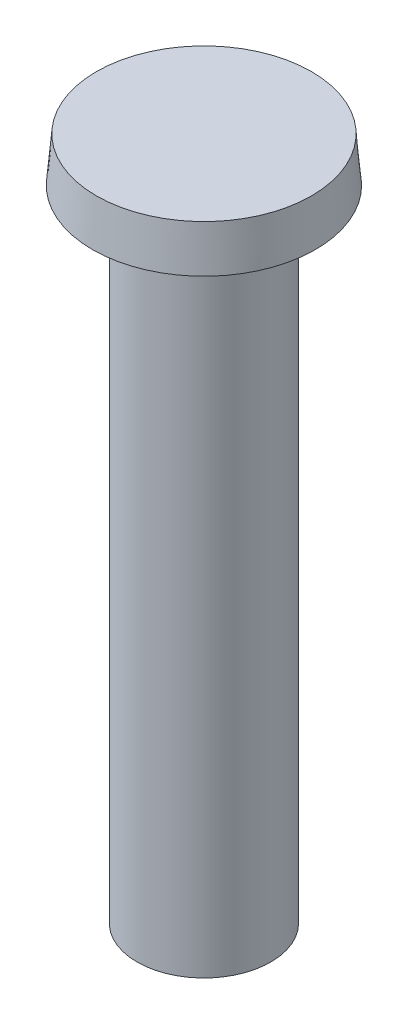
ISO-10303-21;
HEADER;
FILE_DESCRIPTION(('STEP AP214'),'2;1');
FILE_NAME('part.step','',(''),(''),'','','');
FILE_SCHEMA(('AUTOMOTIVE_DESIGN { 1 0 10303 214 1 1 1 1 }'));
ENDSEC;
DATA;
#1=APPLICATION_CONTEXT('core data for automotive mechanical design processes');
#2=APPLICATION_PROTOCOL_DEFINITION('international standard','automotive_design',2000,#1);
#3=PRODUCT_CONTEXT('',#1,'mechanical');
#4=PRODUCT('Part','Part','',(#3));
#5=PRODUCT_RELATED_PRODUCT_CATEGORY('part','',(#4));
#6=PRODUCT_DEFINITION_FORMATION('','',#4);
#7=PRODUCT_DEFINITION_CONTEXT('part definition',#1,'design');
#8=PRODUCT_DEFINITION('design','',#6,#7);
#9=PRODUCT_DEFINITION_SHAPE('','',#8);
#10=(LENGTH_UNIT() NAMED_UNIT(*) SI_UNIT(.MILLI.,.METRE.));
#11=(NAMED_UNIT(*) PLANE_ANGLE_UNIT() SI_UNIT($,.RADIAN.));
#12=(NAMED_UNIT(*) SI_UNIT($,.STERADIAN.) SOLID_ANGLE_UNIT());
#13=UNCERTAINTY_MEASURE_WITH_UNIT(LENGTH_MEASURE(1.E-05),#10,'distance_accuracy_value','');
#14=(GEOMETRIC_REPRESENTATION_CONTEXT(3) GLOBAL_UNCERTAINTY_ASSIGNED_CONTEXT((#13)) GLOBAL_UNIT_ASSIGNED_CONTEXT((#10,
#11,#12)) REPRESENTATION_CONTEXT('',''));
#15=CARTESIAN_POINT('',(0.,0.,0.));
#16=DIRECTION('',(0.,0.,1.));
#17=DIRECTION('',(1.,0.,0.));
#18=AXIS2_PLACEMENT_3D('',#15,#16,#17);
#19=CARTESIAN_POINT('',(0.,21.5,0.));
#20=DIRECTION('',(0.,-1.,0.));
#21=DIRECTION('',(0.,0.,-1.));
#22=AXIS2_PLACEMENT_3D('',#19,#20,#21);
#23=CYLINDRICAL_SURFACE('',#22,2.25);
#24=CARTESIAN_POINT('',(0.,21.5,0.));
#25=DIRECTION('',(0.,1.,0.));
#26=DIRECTION('',(0.,0.,1.));
#27=AXIS2_PLACEMENT_3D('',#24,#25,#26);
#28=CIRCLE('',#27,2.25);
#29=CARTESIAN_POINT('',(0.,21.5,2.25));
#30=VERTEX_POINT('',#29);
#31=EDGE_CURVE('E10',#30,#30,#28,.T.);
#32=ORIENTED_EDGE('',*,*,#31,.F.);
#33=EDGE_LOOP('',(#32));
#34=FACE_BOUND('',#33,.T.);
#35=CARTESIAN_POINT('',(0.,0.,0.));
#36=DIRECTION('',(0.,1.,0.));
#37=DIRECTION('',(0.,0.,1.));
#38=AXIS2_PLACEMENT_3D('',#35,#36,#37);
#39=CIRCLE('',#38,2.25);
#40=CARTESIAN_POINT('',(0.,0.,2.25));
#41=VERTEX_POINT('',#40);
#42=EDGE_CURVE('E38',#41,#41,#39,.T.);
#43=ORIENTED_EDGE('',*,*,#42,.T.);
#44=EDGE_LOOP('',(#43));
#45=FACE_BOUND('',#44,.T.);
#46=ADVANCED_FACE('F35',(#34,#45),#23,.T.);
#47=CARTESIAN_POINT('',(0.,0.,0.));
#48=DIRECTION('',(0.,1.,0.));
#49=DIRECTION('',(0.,0.,1.));
#50=AXIS2_PLACEMENT_3D('',#47,#48,#49);
#51=PLANE('',#50);
#52=CARTESIAN_POINT('',(0.,0.,0.));
#53=DIRECTION('',(0.,-1.,0.));
#54=DIRECTION('',(0.,0.,-1.));
#55=AXIS2_PLACEMENT_3D('',#52,#53,#54);
#56=CIRCLE('',#55,1.);
#57=CARTESIAN_POINT('',(0.,0.,-1.));
#58=VERTEX_POINT('',#57);
#59=EDGE_CURVE('E55',#58,#58,#56,.T.);
#60=ORIENTED_EDGE('',*,*,#59,.F.);
#61=EDGE_LOOP('',(#60));
#62=FACE_BOUND('',#61,.T.);
#63=ORIENTED_EDGE('',*,*,#42,.F.);
#64=EDGE_LOOP('',(#63));
#65=FACE_BOUND('',#64,.T.);
#66=ADVANCED_FACE('F61',(#62,#65),#51,.F.);
#67=CARTESIAN_POINT('',(0.,21.5,0.));
#68=DIRECTION('',(0.,-1.,0.));
#69=DIRECTION('',(0.,0.,1.));
#70=AXIS2_PLACEMENT_3D('',#67,#68,#69);
#71=CONICAL_SURFACE('',#70,3.75,0.0872664625997167);
#72=CARTESIAN_POINT('',(0.,23.,0.));
#73=DIRECTION('',(0.,1.,0.));
#74=DIRECTION('',(0.,0.,1.));
#75=AXIS2_PLACEMENT_3D('',#72,#73,#74);
#76=CIRCLE('',#75,3.61876700471111);
#77=CARTESIAN_POINT('',(0.,23.,3.61876700471111));
#78=VERTEX_POINT('',#77);
#79=EDGE_CURVE('E45',#78,#78,#76,.T.);
#80=ORIENTED_EDGE('',*,*,#79,.F.);
#81=EDGE_LOOP('',(#80));
#82=FACE_BOUND('',#81,.T.);
#83=CARTESIAN_POINT('',(0.,21.5,0.));
#84=DIRECTION('',(0.,1.,0.));
#85=DIRECTION('',(0.,0.,1.));
#86=AXIS2_PLACEMENT_3D('',#83,#84,#85);
#87=CIRCLE('',#86,3.75);
#88=CARTESIAN_POINT('',(0.,21.5,3.75));
#89=VERTEX_POINT('',#88);
#90=EDGE_CURVE('E49',#89,#89,#87,.T.);
#91=ORIENTED_EDGE('',*,*,#90,.T.);
#92=EDGE_LOOP('',(#91));
#93=FACE_BOUND('',#92,.T.);
#94=ADVANCED_FACE('F64',(#82,#93),#71,.T.);
#95=CARTESIAN_POINT('',(0.,23.,0.));
#96=DIRECTION('',(0.,1.,0.));
#97=DIRECTION('',(0.,0.,1.));
#98=AXIS2_PLACEMENT_3D('',#95,#96,#97);
#99=PLANE('',#98);
#100=ORIENTED_EDGE('',*,*,#79,.T.);
#101=EDGE_LOOP('',(#100));
#102=FACE_BOUND('',#101,.T.);
#103=ADVANCED_FACE('F83',(#102),#99,.T.);
#104=CARTESIAN_POINT('',(0.,21.5,0.));
#105=DIRECTION('',(0.,1.,0.));
#106=DIRECTION('',(0.,0.,1.));
#107=AXIS2_PLACEMENT_3D('',#104,#105,#106);
#108=PLANE('',#107);
#109=ORIENTED_EDGE('',*,*,#31,.T.);
#110=EDGE_LOOP('',(#109));
#111=FACE_BOUND('',#110,.T.);
#112=ORIENTED_EDGE('',*,*,#90,.F.);
#113=EDGE_LOOP('',(#112));
#114=FACE_BOUND('',#113,.T.);
#115=ADVANCED_FACE('F91',(#111,#114),#108,.F.);
#116=CARTESIAN_POINT('',(0.,0.,0.));
#117=DIRECTION('',(0.,-1.,0.));
#118=DIRECTION('',(0.,0.,-1.));
#119=AXIS2_PLACEMENT_3D('',#116,#117,#118);
#120=CONICAL_SURFACE('',#119,1.,0.0174532925199433);
#121=CARTESIAN_POINT('',(0.,6.,0.));
#122=DIRECTION('',(0.,-1.,0.));
#123=DIRECTION('',(0.,0.,-1.));
#124=AXIS2_PLACEMENT_3D('',#121,#122,#123);
#125=CIRCLE('',#124,0.895269610430694);
#126=CARTESIAN_POINT('',(0.,6.,-0.895269610430694));
#127=VERTEX_POINT('',#126);
#128=EDGE_CURVE('E52',#127,#127,#125,.T.);
#129=ORIENTED_EDGE('',*,*,#128,.F.);
#130=EDGE_LOOP('',(#129));
#131=FACE_BOUND('',#130,.T.);
#132=ORIENTED_EDGE('',*,*,#59,.T.);
#133=EDGE_LOOP('',(#132));
#134=FACE_BOUND('',#133,.T.);
#135=ADVANCED_FACE('F59',(#131,#134),#120,.F.);
#136=CARTESIAN_POINT('',(0.,6.,0.));
#137=DIRECTION('',(0.,-1.,0.));
#138=DIRECTION('',(0.,0.,-1.));
#139=AXIS2_PLACEMENT_3D('',#136,#137,#138);
#140=PLANE('',#139);
#141=ORIENTED_EDGE('',*,*,#128,.T.);
#142=EDGE_LOOP('',(#141));
#143=FACE_BOUND('',#142,.T.);
#144=ADVANCED_FACE('F103',(#143),#140,.T.);
#145=CLOSED_SHELL('',(#46,#66,#94,#103,#115,#135,#144));
#146=MANIFOLD_SOLID_BREP('B2',#145);
#147=ADVANCED_BREP_SHAPE_REPRESENTATION('',(#18,#146),#14);
#148=SHAPE_DEFINITION_REPRESENTATION(#9,#147);
ENDSEC;
END-ISO-10303-21;
